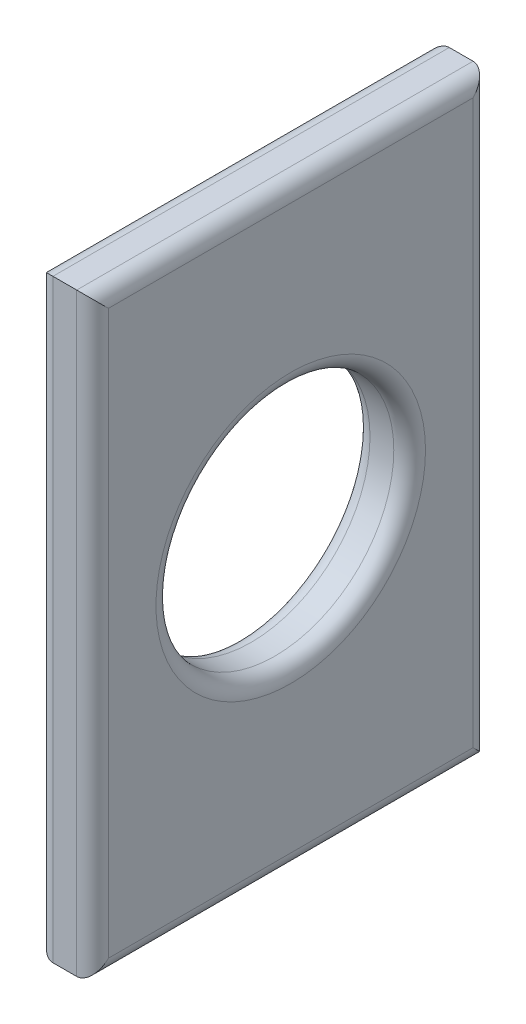
ISO-10303-21;
HEADER;
FILE_DESCRIPTION(('STEP AP214'),'2;1');
FILE_NAME('part.step','',(''),(''),'','','');
FILE_SCHEMA(('AUTOMOTIVE_DESIGN { 1 0 10303 214 1 1 1 1 }'));
ENDSEC;
DATA;
#1=APPLICATION_CONTEXT('core data for automotive mechanical design processes');
#2=APPLICATION_PROTOCOL_DEFINITION('international standard','automotive_design',2000,#1);
#3=PRODUCT_CONTEXT('',#1,'mechanical');
#4=PRODUCT('Part','Part','',(#3));
#5=PRODUCT_RELATED_PRODUCT_CATEGORY('part','',(#4));
#6=PRODUCT_DEFINITION_FORMATION('','',#4);
#7=PRODUCT_DEFINITION_CONTEXT('part definition',#1,'design');
#8=PRODUCT_DEFINITION('design','',#6,#7);
#9=PRODUCT_DEFINITION_SHAPE('','',#8);
#10=(LENGTH_UNIT() NAMED_UNIT(*) SI_UNIT(.MILLI.,.METRE.));
#11=(NAMED_UNIT(*) PLANE_ANGLE_UNIT() SI_UNIT($,.RADIAN.));
#12=(NAMED_UNIT(*) SI_UNIT($,.STERADIAN.) SOLID_ANGLE_UNIT());
#13=UNCERTAINTY_MEASURE_WITH_UNIT(LENGTH_MEASURE(1.E-05),#10,'distance_accuracy_value','');
#14=(GEOMETRIC_REPRESENTATION_CONTEXT(3) GLOBAL_UNCERTAINTY_ASSIGNED_CONTEXT((#13)) GLOBAL_UNIT_ASSIGNED_CONTEXT((#10,
#11,#12)) REPRESENTATION_CONTEXT('',''));
#15=CARTESIAN_POINT('',(0.,0.,0.));
#16=DIRECTION('',(0.,0.,1.));
#17=DIRECTION('',(1.,0.,0.));
#18=AXIS2_PLACEMENT_3D('',#15,#16,#17);
#19=CARTESIAN_POINT('',(1.778,0.,0.));
#20=DIRECTION('',(1.,0.,0.));
#21=DIRECTION('',(0.,0.,-1.));
#22=AXIS2_PLACEMENT_3D('',#19,#20,#21);
#23=PLANE('',#22);
#24=CARTESIAN_POINT('',(1.778,0.,0.));
#25=DIRECTION('',(1.,0.,0.));
#26=DIRECTION('',(0.,0.,-1.));
#27=AXIS2_PLACEMENT_3D('',#24,#25,#26);
#28=CIRCLE('',#27,4.318);
#29=CARTESIAN_POINT('',(1.778,0.,-4.318));
#30=VERTEX_POINT('',#29);
#31=EDGE_CURVE('E11',#30,#30,#28,.F.);
#32=ORIENTED_EDGE('',*,*,#31,.T.);
#33=EDGE_LOOP('',(#32));
#34=FACE_BOUND('',#33,.T.);
#35=DIRECTION('',(0.,-1.,0.));
#36=VECTOR('',#35,1.);
#37=CARTESIAN_POINT('',(1.778,-9.525,5.842));
#38=LINE('',#37,#36);
#39=CARTESIAN_POINT('',(1.778,9.01700000000001,5.842));
#40=VERTEX_POINT('',#39);
#41=CARTESIAN_POINT('',(1.778,-9.017,5.842));
#42=VERTEX_POINT('',#41);
#43=EDGE_CURVE('E57',#40,#42,#38,.T.);
#44=ORIENTED_EDGE('',*,*,#43,.T.);
#45=DIRECTION('',(0.,0.,-1.));
#46=VECTOR('',#45,1.);
#47=CARTESIAN_POINT('',(1.778,-9.017,-6.35));
#48=LINE('',#47,#46);
#49=CARTESIAN_POINT('',(1.778,-9.017,-5.842));
#50=VERTEX_POINT('',#49);
#51=EDGE_CURVE('E49',#42,#50,#48,.T.);
#52=ORIENTED_EDGE('',*,*,#51,.T.);
#53=DIRECTION('',(0.,1.,0.));
#54=VECTOR('',#53,1.);
#55=CARTESIAN_POINT('',(1.778,9.52500000000001,-5.842));
#56=LINE('',#55,#54);
#57=CARTESIAN_POINT('',(1.778,9.01700000000001,-5.842));
#58=VERTEX_POINT('',#57);
#59=EDGE_CURVE('E178',#50,#58,#56,.T.);
#60=ORIENTED_EDGE('',*,*,#59,.T.);
#61=DIRECTION('',(0.,0.,1.));
#62=VECTOR('',#61,1.);
#63=CARTESIAN_POINT('',(1.778,9.01700000000001,6.35));
#64=LINE('',#63,#62);
#65=EDGE_CURVE('E62',#58,#40,#64,.T.);
#66=ORIENTED_EDGE('',*,*,#65,.T.);
#67=EDGE_LOOP('',(#44,#52,#60,#66));
#68=FACE_BOUND('',#67,.T.);
#69=ADVANCED_FACE('F39',(#34,#68),#23,.T.);
#70=CARTESIAN_POINT('',(0.,0.,0.));
#71=DIRECTION('',(1.,0.,0.));
#72=DIRECTION('',(0.,0.,-1.));
#73=AXIS2_PLACEMENT_3D('',#70,#71,#72);
#74=PLANE('',#73);
#75=CARTESIAN_POINT('',(0.,0.,0.));
#76=DIRECTION('',(1.,0.,0.));
#77=DIRECTION('',(0.,0.,-1.));
#78=AXIS2_PLACEMENT_3D('',#75,#76,#77);
#79=CIRCLE('',#78,4.318);
#80=CARTESIAN_POINT('',(0.,0.,-4.318));
#81=VERTEX_POINT('',#80);
#82=EDGE_CURVE('E137',#81,#81,#79,.T.);
#83=ORIENTED_EDGE('',*,*,#82,.T.);
#84=EDGE_LOOP('',(#83));
#85=FACE_BOUND('',#84,.T.);
#86=DIRECTION('',(0.,-1.,0.));
#87=VECTOR('',#86,1.);
#88=CARTESIAN_POINT('',(0.,0.,5.842));
#89=LINE('',#88,#87);
#90=CARTESIAN_POINT('',(0.,-9.017,5.842));
#91=VERTEX_POINT('',#90);
#92=CARTESIAN_POINT('',(0.,9.01700000000001,5.842));
#93=VERTEX_POINT('',#92);
#94=EDGE_CURVE('E135',#91,#93,#89,.F.);
#95=ORIENTED_EDGE('',*,*,#94,.T.);
#96=DIRECTION('',(0.,0.,1.));
#97=VECTOR('',#96,1.);
#98=CARTESIAN_POINT('',(0.,9.01700000000001,0.));
#99=LINE('',#98,#97);
#100=CARTESIAN_POINT('',(0.,9.01700000000001,-5.842));
#101=VERTEX_POINT('',#100);
#102=EDGE_CURVE('E112',#93,#101,#99,.F.);
#103=ORIENTED_EDGE('',*,*,#102,.T.);
#104=DIRECTION('',(0.,1.,0.));
#105=VECTOR('',#104,1.);
#106=CARTESIAN_POINT('',(0.,0.,-5.842));
#107=LINE('',#106,#105);
#108=CARTESIAN_POINT('',(0.,-9.017,-5.842));
#109=VERTEX_POINT('',#108);
#110=EDGE_CURVE('E123',#101,#109,#107,.F.);
#111=ORIENTED_EDGE('',*,*,#110,.T.);
#112=DIRECTION('',(0.,0.,-1.));
#113=VECTOR('',#112,1.);
#114=CARTESIAN_POINT('',(0.,-9.017,0.));
#115=LINE('',#114,#113);
#116=EDGE_CURVE('E130',#109,#91,#115,.F.);
#117=ORIENTED_EDGE('',*,*,#116,.T.);
#118=EDGE_LOOP('',(#95,#103,#111,#117));
#119=FACE_BOUND('',#118,.T.);
#120=ADVANCED_FACE('F133',(#85,#119),#74,.F.);
#121=CARTESIAN_POINT('',(1.778,9.52500000000001,-6.35));
#122=DIRECTION('',(0.,0.,1.));
#123=DIRECTION('',(0.,-1.,0.));
#124=AXIS2_PLACEMENT_3D('',#121,#122,#123);
#125=PLANE('',#124);
#126=DIRECTION('',(-1.,0.,0.));
#127=VECTOR('',#126,1.);
#128=CARTESIAN_POINT('',(1.778,-9.525,-6.35));
#129=LINE('',#128,#127);
#130=CARTESIAN_POINT('',(1.27,-9.525,-6.35));
#131=VERTEX_POINT('',#130);
#132=CARTESIAN_POINT('',(0.508,-9.525,-6.35));
#133=VERTEX_POINT('',#132);
#134=EDGE_CURVE('E194',#131,#133,#129,.T.);
#135=ORIENTED_EDGE('',*,*,#134,.T.);
#136=DIRECTION('',(0.,1.,0.));
#137=VECTOR('',#136,1.);
#138=CARTESIAN_POINT('',(0.508,9.52500000000001,-6.35));
#139=LINE('',#138,#137);
#140=CARTESIAN_POINT('',(0.508,9.52500000000001,-6.35));
#141=VERTEX_POINT('',#140);
#142=EDGE_CURVE('E175',#133,#141,#139,.T.);
#143=ORIENTED_EDGE('',*,*,#142,.T.);
#144=DIRECTION('',(-1.,0.,0.));
#145=VECTOR('',#144,1.);
#146=CARTESIAN_POINT('',(1.778,9.52500000000001,-6.35));
#147=LINE('',#146,#145);
#148=CARTESIAN_POINT('',(1.27,9.52500000000001,-6.35));
#149=VERTEX_POINT('',#148);
#150=EDGE_CURVE('E131',#149,#141,#147,.T.);
#151=ORIENTED_EDGE('',*,*,#150,.F.);
#152=DIRECTION('',(0.,1.,0.));
#153=VECTOR('',#152,1.);
#154=CARTESIAN_POINT('',(1.27,-9.525,-6.35));
#155=LINE('',#154,#153);
#156=EDGE_CURVE('E172',#149,#131,#155,.F.);
#157=ORIENTED_EDGE('',*,*,#156,.T.);
#158=EDGE_LOOP('',(#135,#143,#151,#157));
#159=FACE_BOUND('',#158,.T.);
#160=ADVANCED_FACE('F223',(#159),#125,.F.);
#161=CARTESIAN_POINT('',(1.778,9.52500000000001,6.35));
#162=DIRECTION('',(0.,-1.,0.));
#163=DIRECTION('',(0.,0.,-1.));
#164=AXIS2_PLACEMENT_3D('',#161,#162,#163);
#165=PLANE('',#164);
#166=ORIENTED_EDGE('',*,*,#150,.T.);
#167=DIRECTION('',(0.,0.,1.));
#168=VECTOR('',#167,1.);
#169=CARTESIAN_POINT('',(0.508,9.52500000000001,6.35));
#170=LINE('',#169,#168);
#171=CARTESIAN_POINT('',(0.508,9.52500000000001,6.35));
#172=VERTEX_POINT('',#171);
#173=EDGE_CURVE('E115',#141,#172,#170,.T.);
#174=ORIENTED_EDGE('',*,*,#173,.T.);
#175=DIRECTION('',(-1.,0.,0.));
#176=VECTOR('',#175,1.);
#177=CARTESIAN_POINT('',(1.778,9.52500000000001,6.35));
#178=LINE('',#177,#176);
#179=CARTESIAN_POINT('',(1.27,9.52500000000001,6.35));
#180=VERTEX_POINT('',#179);
#181=EDGE_CURVE('E220',#180,#172,#178,.T.);
#182=ORIENTED_EDGE('',*,*,#181,.F.);
#183=DIRECTION('',(0.,0.,1.));
#184=VECTOR('',#183,1.);
#185=CARTESIAN_POINT('',(1.27,9.52500000000001,-6.35));
#186=LINE('',#185,#184);
#187=EDGE_CURVE('E154',#180,#149,#186,.F.);
#188=ORIENTED_EDGE('',*,*,#187,.T.);
#189=EDGE_LOOP('',(#166,#174,#182,#188));
#190=FACE_BOUND('',#189,.T.);
#191=ADVANCED_FACE('F218',(#190),#165,.F.);
#192=CARTESIAN_POINT('',(1.778,9.52500000000001,6.35));
#193=DIRECTION('',(0.,0.,-1.));
#194=DIRECTION('',(0.,1.,0.));
#195=AXIS2_PLACEMENT_3D('',#192,#193,#194);
#196=PLANE('',#195);
#197=ORIENTED_EDGE('',*,*,#181,.T.);
#198=DIRECTION('',(0.,-1.,0.));
#199=VECTOR('',#198,1.);
#200=CARTESIAN_POINT('',(0.508,9.52500000000001,6.35));
#201=LINE('',#200,#199);
#202=CARTESIAN_POINT('',(0.508,-9.525,6.35));
#203=VERTEX_POINT('',#202);
#204=EDGE_CURVE('E162',#172,#203,#201,.T.);
#205=ORIENTED_EDGE('',*,*,#204,.T.);
#206=DIRECTION('',(-1.,0.,0.));
#207=VECTOR('',#206,1.);
#208=CARTESIAN_POINT('',(1.778,-9.525,6.35));
#209=LINE('',#208,#207);
#210=CARTESIAN_POINT('',(1.27,-9.525,6.35));
#211=VERTEX_POINT('',#210);
#212=EDGE_CURVE('E228',#211,#203,#209,.T.);
#213=ORIENTED_EDGE('',*,*,#212,.F.);
#214=DIRECTION('',(0.,-1.,0.));
#215=VECTOR('',#214,1.);
#216=CARTESIAN_POINT('',(1.27,9.52500000000001,6.35));
#217=LINE('',#216,#215);
#218=EDGE_CURVE('E159',#211,#180,#217,.F.);
#219=ORIENTED_EDGE('',*,*,#218,.T.);
#220=EDGE_LOOP('',(#197,#205,#213,#219));
#221=FACE_BOUND('',#220,.T.);
#222=ADVANCED_FACE('F242',(#221),#196,.F.);
#223=CARTESIAN_POINT('',(1.778,-9.525,6.35));
#224=DIRECTION('',(0.,1.,0.));
#225=DIRECTION('',(0.,0.,1.));
#226=AXIS2_PLACEMENT_3D('',#223,#224,#225);
#227=PLANE('',#226);
#228=ORIENTED_EDGE('',*,*,#212,.T.);
#229=DIRECTION('',(0.,0.,-1.));
#230=VECTOR('',#229,1.);
#231=CARTESIAN_POINT('',(0.508,-9.525,6.35));
#232=LINE('',#231,#230);
#233=EDGE_CURVE('E169',#203,#133,#232,.T.);
#234=ORIENTED_EDGE('',*,*,#233,.T.);
#235=ORIENTED_EDGE('',*,*,#134,.F.);
#236=DIRECTION('',(0.,0.,-1.));
#237=VECTOR('',#236,1.);
#238=CARTESIAN_POINT('',(1.27,-9.525,6.35));
#239=LINE('',#238,#237);
#240=EDGE_CURVE('E165',#131,#211,#239,.F.);
#241=ORIENTED_EDGE('',*,*,#240,.T.);
#242=EDGE_LOOP('',(#228,#234,#235,#241));
#243=FACE_BOUND('',#242,.T.);
#244=ADVANCED_FACE('F248',(#243),#227,.F.);
#245=CARTESIAN_POINT('',(1.778,0.,0.));
#246=DIRECTION('',(-1.,0.,0.));
#247=DIRECTION('',(0.,0.,1.));
#248=AXIS2_PLACEMENT_3D('',#245,#246,#247);
#249=CYLINDRICAL_SURFACE('',#248,3.81);
#250=CARTESIAN_POINT('',(0.508,0.,0.));
#251=DIRECTION('',(1.,0.,0.));
#252=DIRECTION('',(0.,0.,-1.));
#253=AXIS2_PLACEMENT_3D('',#250,#251,#252);
#254=CIRCLE('',#253,3.81);
#255=CARTESIAN_POINT('',(0.508,0.,-3.81));
#256=VERTEX_POINT('',#255);
#257=EDGE_CURVE('E150',#256,#256,#254,.F.);
#258=ORIENTED_EDGE('',*,*,#257,.T.);
#259=EDGE_LOOP('',(#258));
#260=FACE_BOUND('',#259,.T.);
#261=CARTESIAN_POINT('',(1.27,0.,0.));
#262=DIRECTION('',(1.,0.,0.));
#263=DIRECTION('',(0.,0.,-1.));
#264=AXIS2_PLACEMENT_3D('',#261,#262,#263);
#265=CIRCLE('',#264,3.81);
#266=CARTESIAN_POINT('',(1.27,0.,-3.81));
#267=VERTEX_POINT('',#266);
#268=EDGE_CURVE('E142',#267,#267,#265,.T.);
#269=ORIENTED_EDGE('',*,*,#268,.T.);
#270=EDGE_LOOP('',(#269));
#271=FACE_BOUND('',#270,.T.);
#272=ADVANCED_FACE('F263',(#260,#271),#249,.F.);
#273=CARTESIAN_POINT('',(0.508,0.,0.));
#274=DIRECTION('',(1.,0.,0.));
#275=DIRECTION('',(0.,0.,-1.));
#276=AXIS2_PLACEMENT_3D('',#273,#274,#275);
#277=TOROIDAL_SURFACE('',#276,4.318,0.508);
#278=ORIENTED_EDGE('',*,*,#257,.F.);
#279=EDGE_LOOP('',(#278));
#280=FACE_BOUND('',#279,.T.);
#281=ORIENTED_EDGE('',*,*,#82,.F.);
#282=EDGE_LOOP('',(#281));
#283=FACE_BOUND('',#282,.T.);
#284=ADVANCED_FACE('F273',(#280,#283),#277,.T.);
#285=CARTESIAN_POINT('',(0.508,-9.017,6.35));
#286=DIRECTION('',(0.,0.,-1.));
#287=DIRECTION('',(-1.,0.,0.));
#288=AXIS2_PLACEMENT_3D('',#285,#286,#287);
#289=CYLINDRICAL_SURFACE('',#288,0.508);
#290=CARTESIAN_POINT('',(0.508,-9.017,5.842));
#291=DIRECTION('',(0.,-0.707106781186547,-0.707106781186548));
#292=DIRECTION('',(0.,0.707106781186548,-0.707106781186547));
#293=AXIS2_PLACEMENT_3D('',#290,#291,#292);
#294=ELLIPSE('',#293,0.718420489685532,0.508);
#295=EDGE_CURVE('E119',#91,#203,#294,.F.);
#296=ORIENTED_EDGE('',*,*,#295,.F.);
#297=ORIENTED_EDGE('',*,*,#116,.F.);
#298=CARTESIAN_POINT('',(0.508,-9.017,-5.842));
#299=DIRECTION('',(0.,0.707106781186548,-0.707106781186547));
#300=DIRECTION('',(0.,0.707106781186547,0.707106781186548));
#301=AXIS2_PLACEMENT_3D('',#298,#299,#300);
#302=ELLIPSE('',#301,0.718420489685532,0.508);
#303=EDGE_CURVE('E126',#133,#109,#302,.T.);
#304=ORIENTED_EDGE('',*,*,#303,.F.);
#305=ORIENTED_EDGE('',*,*,#233,.F.);
#306=EDGE_LOOP('',(#296,#297,#304,#305));
#307=FACE_BOUND('',#306,.T.);
#308=ADVANCED_FACE('F235',(#307),#289,.T.);
#309=CARTESIAN_POINT('',(0.508,9.52500000000001,-5.842));
#310=DIRECTION('',(0.,1.,0.));
#311=DIRECTION('',(0.,0.,1.));
#312=AXIS2_PLACEMENT_3D('',#309,#310,#311);
#313=CYLINDRICAL_SURFACE('',#312,0.508);
#314=ORIENTED_EDGE('',*,*,#303,.T.);
#315=ORIENTED_EDGE('',*,*,#110,.F.);
#316=CARTESIAN_POINT('',(0.508,9.01700000000001,-5.842));
#317=DIRECTION('',(0.,0.707106781186547,0.707106781186548));
#318=DIRECTION('',(0.,0.707106781186548,-0.707106781186547));
#319=AXIS2_PLACEMENT_3D('',#316,#317,#318);
#320=ELLIPSE('',#319,0.718420489685532,0.508);
#321=EDGE_CURVE('E108',#141,#101,#320,.T.);
#322=ORIENTED_EDGE('',*,*,#321,.F.);
#323=ORIENTED_EDGE('',*,*,#142,.F.);
#324=EDGE_LOOP('',(#314,#315,#322,#323));
#325=FACE_BOUND('',#324,.T.);
#326=ADVANCED_FACE('F124',(#325),#313,.T.);
#327=CARTESIAN_POINT('',(0.508,9.52500000000001,5.842));
#328=DIRECTION('',(0.,-1.,0.));
#329=DIRECTION('',(0.,0.,-1.));
#330=AXIS2_PLACEMENT_3D('',#327,#328,#329);
#331=CYLINDRICAL_SURFACE('',#330,0.508);
#332=ORIENTED_EDGE('',*,*,#295,.T.);
#333=ORIENTED_EDGE('',*,*,#204,.F.);
#334=CARTESIAN_POINT('',(0.508,9.01700000000001,5.842));
#335=DIRECTION('',(0.,-0.707106781186548,0.707106781186547));
#336=DIRECTION('',(0.,-0.707106781186547,-0.707106781186548));
#337=AXIS2_PLACEMENT_3D('',#334,#335,#336);
#338=ELLIPSE('',#337,0.718420489685532,0.508);
#339=EDGE_CURVE('E120',#93,#172,#338,.F.);
#340=ORIENTED_EDGE('',*,*,#339,.F.);
#341=ORIENTED_EDGE('',*,*,#94,.F.);
#342=EDGE_LOOP('',(#332,#333,#340,#341));
#343=FACE_BOUND('',#342,.T.);
#344=ADVANCED_FACE('F238',(#343),#331,.T.);
#345=CARTESIAN_POINT('',(0.508,9.01700000000001,6.35));
#346=DIRECTION('',(0.,0.,1.));
#347=DIRECTION('',(1.,0.,0.));
#348=AXIS2_PLACEMENT_3D('',#345,#346,#347);
#349=CYLINDRICAL_SURFACE('',#348,0.508);
#350=ORIENTED_EDGE('',*,*,#321,.T.);
#351=ORIENTED_EDGE('',*,*,#102,.F.);
#352=ORIENTED_EDGE('',*,*,#339,.T.);
#353=ORIENTED_EDGE('',*,*,#173,.F.);
#354=EDGE_LOOP('',(#350,#351,#352,#353));
#355=FACE_BOUND('',#354,.T.);
#356=ADVANCED_FACE('F110',(#355),#349,.T.);
#357=CARTESIAN_POINT('',(1.27,0.,0.));
#358=DIRECTION('',(1.,0.,0.));
#359=DIRECTION('',(0.,0.,-1.));
#360=AXIS2_PLACEMENT_3D('',#357,#358,#359);
#361=TOROIDAL_SURFACE('',#360,4.318,0.508);
#362=ORIENTED_EDGE('',*,*,#31,.F.);
#363=EDGE_LOOP('',(#362));
#364=FACE_BOUND('',#363,.T.);
#365=ORIENTED_EDGE('',*,*,#268,.F.);
#366=EDGE_LOOP('',(#365));
#367=FACE_BOUND('',#366,.T.);
#368=ADVANCED_FACE('F279',(#364,#367),#361,.T.);
#369=CARTESIAN_POINT('',(1.27,9.01700000000001,0.));
#370=DIRECTION('',(0.,0.,-1.));
#371=DIRECTION('',(-1.,0.,0.));
#372=AXIS2_PLACEMENT_3D('',#369,#370,#371);
#373=CYLINDRICAL_SURFACE('',#372,0.508);
#374=CARTESIAN_POINT('',(1.27,9.01700000000001,-5.842));
#375=DIRECTION('',(0.,-0.707106781186547,-0.707106781186548));
#376=DIRECTION('',(0.,-0.707106781186548,0.707106781186547));
#377=AXIS2_PLACEMENT_3D('',#374,#375,#376);
#378=ELLIPSE('',#377,0.718420489685532,0.508);
#379=EDGE_CURVE('E200',#149,#58,#378,.T.);
#380=ORIENTED_EDGE('',*,*,#379,.F.);
#381=ORIENTED_EDGE('',*,*,#187,.F.);
#382=CARTESIAN_POINT('',(1.27,9.01700000000001,5.842));
#383=DIRECTION('',(0.,0.707106781186548,-0.707106781186547));
#384=DIRECTION('',(0.,-0.707106781186547,-0.707106781186548));
#385=AXIS2_PLACEMENT_3D('',#382,#383,#384);
#386=ELLIPSE('',#385,0.718420489685532,0.508);
#387=EDGE_CURVE('E43',#40,#180,#386,.F.);
#388=ORIENTED_EDGE('',*,*,#387,.F.);
#389=ORIENTED_EDGE('',*,*,#65,.F.);
#390=EDGE_LOOP('',(#380,#381,#388,#389));
#391=FACE_BOUND('',#390,.T.);
#392=ADVANCED_FACE('F41',(#391),#373,.T.);
#393=CARTESIAN_POINT('',(1.27,0.,5.842));
#394=DIRECTION('',(0.,1.,0.));
#395=DIRECTION('',(0.,0.,1.));
#396=AXIS2_PLACEMENT_3D('',#393,#394,#395);
#397=CYLINDRICAL_SURFACE('',#396,0.508);
#398=ORIENTED_EDGE('',*,*,#387,.T.);
#399=ORIENTED_EDGE('',*,*,#218,.F.);
#400=CARTESIAN_POINT('',(1.27,-9.017,5.842));
#401=DIRECTION('',(0.,0.707106781186547,0.707106781186548));
#402=DIRECTION('',(0.,0.707106781186548,-0.707106781186547));
#403=AXIS2_PLACEMENT_3D('',#400,#401,#402);
#404=ELLIPSE('',#403,0.718420489685532,0.508);
#405=EDGE_CURVE('E198',#42,#211,#404,.F.);
#406=ORIENTED_EDGE('',*,*,#405,.F.);
#407=ORIENTED_EDGE('',*,*,#43,.F.);
#408=EDGE_LOOP('',(#398,#399,#406,#407));
#409=FACE_BOUND('',#408,.T.);
#410=ADVANCED_FACE('F211',(#409),#397,.T.);
#411=CARTESIAN_POINT('',(1.27,0.,-5.842));
#412=DIRECTION('',(0.,-1.,0.));
#413=DIRECTION('',(0.,0.,-1.));
#414=AXIS2_PLACEMENT_3D('',#411,#412,#413);
#415=CYLINDRICAL_SURFACE('',#414,0.508);
#416=ORIENTED_EDGE('',*,*,#379,.T.);
#417=ORIENTED_EDGE('',*,*,#59,.F.);
#418=CARTESIAN_POINT('',(1.27,-9.017,-5.842));
#419=DIRECTION('',(0.,-0.707106781186548,0.707106781186547));
#420=DIRECTION('',(0.,-0.707106781186547,-0.707106781186548));
#421=AXIS2_PLACEMENT_3D('',#418,#419,#420);
#422=ELLIPSE('',#421,0.718420489685532,0.508);
#423=EDGE_CURVE('E195',#131,#50,#422,.T.);
#424=ORIENTED_EDGE('',*,*,#423,.F.);
#425=ORIENTED_EDGE('',*,*,#156,.F.);
#426=EDGE_LOOP('',(#416,#417,#424,#425));
#427=FACE_BOUND('',#426,.T.);
#428=ADVANCED_FACE('F253',(#427),#415,.T.);
#429=CARTESIAN_POINT('',(1.27,-9.017,0.));
#430=DIRECTION('',(0.,0.,1.));
#431=DIRECTION('',(1.,0.,0.));
#432=AXIS2_PLACEMENT_3D('',#429,#430,#431);
#433=CYLINDRICAL_SURFACE('',#432,0.508);
#434=ORIENTED_EDGE('',*,*,#405,.T.);
#435=ORIENTED_EDGE('',*,*,#240,.F.);
#436=ORIENTED_EDGE('',*,*,#423,.T.);
#437=ORIENTED_EDGE('',*,*,#51,.F.);
#438=EDGE_LOOP('',(#434,#435,#436,#437));
#439=FACE_BOUND('',#438,.T.);
#440=ADVANCED_FACE('F251',(#439),#433,.T.);
#441=CLOSED_SHELL('',(#69,#120,#160,#191,#222,#244,#272,#284,#308,#326,#344,#356,#368,#392,#410,
#428,#440));
#442=MANIFOLD_SOLID_BREP('B2',#441);
#443=ADVANCED_BREP_SHAPE_REPRESENTATION('',(#18,#442),#14);
#444=SHAPE_DEFINITION_REPRESENTATION(#9,#443);
ENDSEC;
END-ISO-10303-21;
